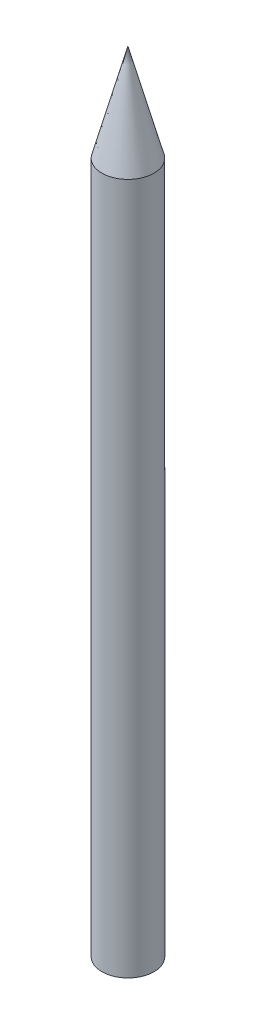
ISO-10303-21;
HEADER;
FILE_DESCRIPTION(('STEP AP214'),'2;1');
FILE_NAME('part.step','',(''),(''),'','','');
FILE_SCHEMA(('AUTOMOTIVE_DESIGN { 1 0 10303 214 1 1 1 1 }'));
ENDSEC;
DATA;
#1=APPLICATION_CONTEXT('core data for automotive mechanical design processes');
#2=APPLICATION_PROTOCOL_DEFINITION('international standard','automotive_design',2000,#1);
#3=PRODUCT_CONTEXT('',#1,'mechanical');
#4=PRODUCT('Part','Part','',(#3));
#5=PRODUCT_RELATED_PRODUCT_CATEGORY('part','',(#4));
#6=PRODUCT_DEFINITION_FORMATION('','',#4);
#7=PRODUCT_DEFINITION_CONTEXT('part definition',#1,'design');
#8=PRODUCT_DEFINITION('design','',#6,#7);
#9=PRODUCT_DEFINITION_SHAPE('','',#8);
#10=(LENGTH_UNIT() NAMED_UNIT(*) SI_UNIT(.MILLI.,.METRE.));
#11=(NAMED_UNIT(*) PLANE_ANGLE_UNIT() SI_UNIT($,.RADIAN.));
#12=(NAMED_UNIT(*) SI_UNIT($,.STERADIAN.) SOLID_ANGLE_UNIT());
#13=UNCERTAINTY_MEASURE_WITH_UNIT(LENGTH_MEASURE(1.E-05),#10,'distance_accuracy_value','');
#14=(GEOMETRIC_REPRESENTATION_CONTEXT(3) GLOBAL_UNCERTAINTY_ASSIGNED_CONTEXT((#13)) GLOBAL_UNIT_ASSIGNED_CONTEXT((#10,
#11,#12)) REPRESENTATION_CONTEXT('',''));
#15=CARTESIAN_POINT('',(0.,0.,0.));
#16=DIRECTION('',(0.,0.,1.));
#17=DIRECTION('',(1.,0.,0.));
#18=AXIS2_PLACEMENT_3D('',#15,#16,#17);
#19=CARTESIAN_POINT('',(0.,-1.23157676649777,0.));
#20=DIRECTION('',(0.,-1.,0.));
#21=DIRECTION('',(0.,0.,-1.));
#22=AXIS2_PLACEMENT_3D('',#19,#20,#21);
#23=CONICAL_SURFACE('',#22,0.330000000000001,0.261799387799143);
#24=CARTESIAN_POINT('',(0.,0.,0.));
#25=VERTEX_POINT('',#24);
#26=VERTEX_LOOP('',#25);
#27=FACE_BOUND('',#26,.T.);
#28=CARTESIAN_POINT('',(0.,-1.23157676649777,0.));
#29=DIRECTION('',(0.,1.,0.));
#30=DIRECTION('',(0.,0.,1.));
#31=AXIS2_PLACEMENT_3D('',#28,#29,#30);
#32=CIRCLE('',#31,0.330000000000001);
#33=CARTESIAN_POINT('',(0.,-1.23157676649777,0.330000000000001));
#34=VERTEX_POINT('',#33);
#35=EDGE_CURVE('E11',#34,#34,#32,.T.);
#36=ORIENTED_EDGE('',*,*,#35,.T.);
#37=EDGE_LOOP('',(#36));
#38=FACE_BOUND('',#37,.T.);
#39=ADVANCED_FACE('F35',(#27,#38),#23,.T.);
#40=CARTESIAN_POINT('',(0.,0.,0.));
#41=DIRECTION('',(0.,1.,0.));
#42=DIRECTION('',(0.,0.,1.));
#43=AXIS2_PLACEMENT_3D('',#40,#41,#42);
#44=CYLINDRICAL_SURFACE('',#43,0.330000000000001);
#45=ORIENTED_EDGE('',*,*,#35,.F.);
#46=EDGE_LOOP('',(#45));
#47=FACE_BOUND('',#46,.T.);
#48=CARTESIAN_POINT('',(0.,-10.,0.));
#49=DIRECTION('',(0.,1.,0.));
#50=DIRECTION('',(0.,0.,1.));
#51=AXIS2_PLACEMENT_3D('',#48,#49,#50);
#52=CIRCLE('',#51,0.33);
#53=CARTESIAN_POINT('',(0.,-10.,0.329999999999999));
#54=VERTEX_POINT('',#53);
#55=EDGE_CURVE('E41',#54,#54,#52,.T.);
#56=ORIENTED_EDGE('',*,*,#55,.T.);
#57=EDGE_LOOP('',(#56));
#58=FACE_BOUND('',#57,.T.);
#59=ADVANCED_FACE('F46',(#47,#58),#44,.T.);
#60=CARTESIAN_POINT('',(0.,-10.,0.));
#61=DIRECTION('',(0.,1.,0.));
#62=DIRECTION('',(0.,0.,1.));
#63=AXIS2_PLACEMENT_3D('',#60,#61,#62);
#64=PLANE('',#63);
#65=ORIENTED_EDGE('',*,*,#55,.F.);
#66=EDGE_LOOP('',(#65));
#67=FACE_BOUND('',#66,.T.);
#68=ADVANCED_FACE('F51',(#67),#64,.F.);
#69=CLOSED_SHELL('',(#39,#59,#68));
#70=MANIFOLD_SOLID_BREP('B2',#69);
#71=ADVANCED_BREP_SHAPE_REPRESENTATION('',(#18,#70),#14);
#72=SHAPE_DEFINITION_REPRESENTATION(#9,#71);
ENDSEC;
END-ISO-10303-21;
